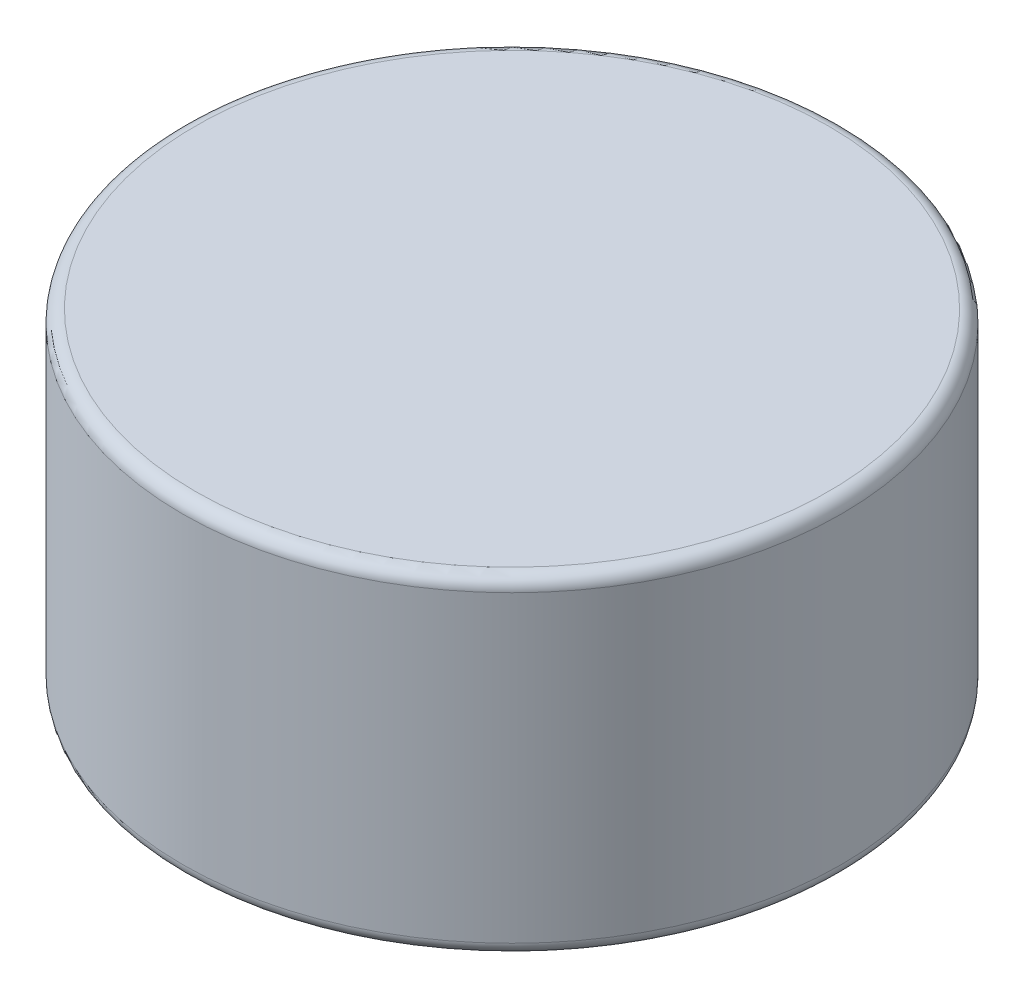
ISO-10303-21;
HEADER;
FILE_DESCRIPTION(('STEP AP214'),'2;1');
FILE_NAME('part.step','',(''),(''),'','','');
FILE_SCHEMA(('AUTOMOTIVE_DESIGN { 1 0 10303 214 1 1 1 1 }'));
ENDSEC;
DATA;
#1=APPLICATION_CONTEXT('core data for automotive mechanical design processes');
#2=APPLICATION_PROTOCOL_DEFINITION('international standard','automotive_design',2000,#1);
#3=PRODUCT_CONTEXT('',#1,'mechanical');
#4=PRODUCT('Part','Part','',(#3));
#5=PRODUCT_RELATED_PRODUCT_CATEGORY('part','',(#4));
#6=PRODUCT_DEFINITION_FORMATION('','',#4);
#7=PRODUCT_DEFINITION_CONTEXT('part definition',#1,'design');
#8=PRODUCT_DEFINITION('design','',#6,#7);
#9=PRODUCT_DEFINITION_SHAPE('','',#8);
#10=(LENGTH_UNIT() NAMED_UNIT(*) SI_UNIT(.MILLI.,.METRE.));
#11=(NAMED_UNIT(*) PLANE_ANGLE_UNIT() SI_UNIT($,.RADIAN.));
#12=(NAMED_UNIT(*) SI_UNIT($,.STERADIAN.) SOLID_ANGLE_UNIT());
#13=UNCERTAINTY_MEASURE_WITH_UNIT(LENGTH_MEASURE(1.E-05),#10,'distance_accuracy_value','');
#14=(GEOMETRIC_REPRESENTATION_CONTEXT(3) GLOBAL_UNCERTAINTY_ASSIGNED_CONTEXT((#13)) GLOBAL_UNIT_ASSIGNED_CONTEXT((#10,
#11,#12)) REPRESENTATION_CONTEXT('',''));
#15=CARTESIAN_POINT('',(0.,0.,0.));
#16=DIRECTION('',(0.,0.,1.));
#17=DIRECTION('',(1.,0.,0.));
#18=AXIS2_PLACEMENT_3D('',#15,#16,#17);
#19=CARTESIAN_POINT('',(0.,6.35,0.));
#20=DIRECTION('',(0.,-1.,0.));
#21=DIRECTION('',(0.,0.,-1.));
#22=AXIS2_PLACEMENT_3D('',#19,#20,#21);
#23=CYLINDRICAL_SURFACE('',#22,12.7);
#24=CARTESIAN_POINT('',(0.,-5.85,0.));
#25=DIRECTION('',(0.,1.,0.));
#26=DIRECTION('',(0.,0.,1.));
#27=AXIS2_PLACEMENT_3D('',#24,#25,#26);
#28=CIRCLE('',#27,12.7);
#29=CARTESIAN_POINT('',(0.,-5.85,12.7));
#30=VERTEX_POINT('',#29);
#31=EDGE_CURVE('E54',#30,#30,#28,.T.);
#32=ORIENTED_EDGE('',*,*,#31,.T.);
#33=EDGE_LOOP('',(#32));
#34=FACE_BOUND('',#33,.T.);
#35=CARTESIAN_POINT('',(0.,5.85,0.));
#36=DIRECTION('',(0.,1.,0.));
#37=DIRECTION('',(0.,0.,1.));
#38=AXIS2_PLACEMENT_3D('',#35,#36,#37);
#39=CIRCLE('',#38,12.7);
#40=CARTESIAN_POINT('',(0.,5.85,12.7));
#41=VERTEX_POINT('',#40);
#42=EDGE_CURVE('E59',#41,#41,#39,.F.);
#43=ORIENTED_EDGE('',*,*,#42,.T.);
#44=EDGE_LOOP('',(#43));
#45=FACE_BOUND('',#44,.T.);
#46=ADVANCED_FACE('F41',(#34,#45),#23,.T.);
#47=CARTESIAN_POINT('',(0.,6.35,0.));
#48=DIRECTION('',(0.,1.,0.));
#49=DIRECTION('',(0.,0.,1.));
#50=AXIS2_PLACEMENT_3D('',#47,#48,#49);
#51=PLANE('',#50);
#52=CARTESIAN_POINT('',(0.,6.35,0.));
#53=DIRECTION('',(0.,1.,0.));
#54=DIRECTION('',(0.,0.,1.));
#55=AXIS2_PLACEMENT_3D('',#52,#53,#54);
#56=CIRCLE('',#55,12.2);
#57=CARTESIAN_POINT('',(0.,6.35,12.2));
#58=VERTEX_POINT('',#57);
#59=EDGE_CURVE('E10',#58,#58,#56,.T.);
#60=ORIENTED_EDGE('',*,*,#59,.T.);
#61=EDGE_LOOP('',(#60));
#62=FACE_BOUND('',#61,.T.);
#63=ADVANCED_FACE('F76',(#62),#51,.T.);
#64=CARTESIAN_POINT('',(0.,-6.35,0.));
#65=DIRECTION('',(0.,1.,0.));
#66=DIRECTION('',(0.,0.,1.));
#67=AXIS2_PLACEMENT_3D('',#64,#65,#66);
#68=PLANE('',#67);
#69=CARTESIAN_POINT('',(0.,-6.35,0.));
#70=DIRECTION('',(0.,1.,0.));
#71=DIRECTION('',(0.,0.,1.));
#72=AXIS2_PLACEMENT_3D('',#69,#70,#71);
#73=CIRCLE('',#72,12.2);
#74=CARTESIAN_POINT('',(0.,-6.35,12.2));
#75=VERTEX_POINT('',#74);
#76=EDGE_CURVE('E49',#75,#75,#73,.F.);
#77=ORIENTED_EDGE('',*,*,#76,.T.);
#78=EDGE_LOOP('',(#77));
#79=FACE_BOUND('',#78,.T.);
#80=ADVANCED_FACE('F73',(#79),#68,.F.);
#81=CARTESIAN_POINT('',(0.,-5.85,0.));
#82=DIRECTION('',(0.,1.,0.));
#83=DIRECTION('',(0.,0.,1.));
#84=AXIS2_PLACEMENT_3D('',#81,#82,#83);
#85=TOROIDAL_SURFACE('',#84,12.2,0.5);
#86=ORIENTED_EDGE('',*,*,#76,.F.);
#87=EDGE_LOOP('',(#86));
#88=FACE_BOUND('',#87,.T.);
#89=ORIENTED_EDGE('',*,*,#31,.F.);
#90=EDGE_LOOP('',(#89));
#91=FACE_BOUND('',#90,.T.);
#92=ADVANCED_FACE('F69',(#88,#91),#85,.T.);
#93=CARTESIAN_POINT('',(0.,5.85,0.));
#94=DIRECTION('',(0.,1.,0.));
#95=DIRECTION('',(0.,0.,1.));
#96=AXIS2_PLACEMENT_3D('',#93,#94,#95);
#97=TOROIDAL_SURFACE('',#96,12.2,0.5);
#98=ORIENTED_EDGE('',*,*,#42,.F.);
#99=EDGE_LOOP('',(#98));
#100=FACE_BOUND('',#99,.T.);
#101=ORIENTED_EDGE('',*,*,#59,.F.);
#102=EDGE_LOOP('',(#101));
#103=FACE_BOUND('',#102,.T.);
#104=ADVANCED_FACE('F43',(#100,#103),#97,.T.);
#105=CLOSED_SHELL('',(#46,#63,#80,#92,#104));
#106=MANIFOLD_SOLID_BREP('B2',#105);
#107=ADVANCED_BREP_SHAPE_REPRESENTATION('',(#18,#106),#14);
#108=SHAPE_DEFINITION_REPRESENTATION(#9,#107);
ENDSEC;
END-ISO-10303-21;
